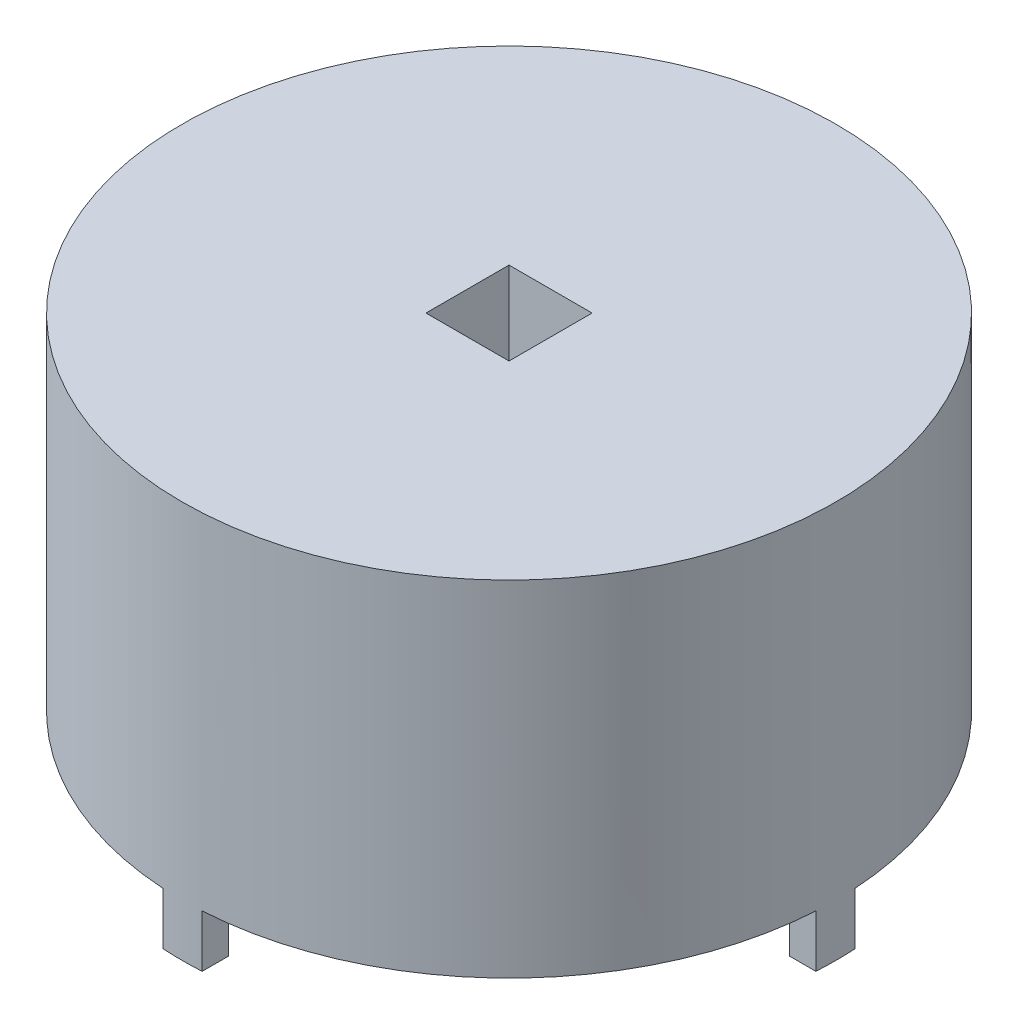
ISO-10303-21;
HEADER;
FILE_DESCRIPTION(('STEP AP214'),'2;1');
FILE_NAME('part.step','',(''),(''),'','','');
FILE_SCHEMA(('AUTOMOTIVE_DESIGN { 1 0 10303 214 1 1 1 1 }'));
ENDSEC;
DATA;
#1=APPLICATION_CONTEXT('core data for automotive mechanical design processes');
#2=APPLICATION_PROTOCOL_DEFINITION('international standard','automotive_design',2000,#1);
#3=PRODUCT_CONTEXT('',#1,'mechanical');
#4=PRODUCT('Part','Part','',(#3));
#5=PRODUCT_RELATED_PRODUCT_CATEGORY('part','',(#4));
#6=PRODUCT_DEFINITION_FORMATION('','',#4);
#7=PRODUCT_DEFINITION_CONTEXT('part definition',#1,'design');
#8=PRODUCT_DEFINITION('design','',#6,#7);
#9=PRODUCT_DEFINITION_SHAPE('','',#8);
#10=(LENGTH_UNIT() NAMED_UNIT(*) SI_UNIT(.MILLI.,.METRE.));
#11=(NAMED_UNIT(*) PLANE_ANGLE_UNIT() SI_UNIT($,.RADIAN.));
#12=(NAMED_UNIT(*) SI_UNIT($,.STERADIAN.) SOLID_ANGLE_UNIT());
#13=UNCERTAINTY_MEASURE_WITH_UNIT(LENGTH_MEASURE(1.E-05),#10,'distance_accuracy_value','');
#14=(GEOMETRIC_REPRESENTATION_CONTEXT(3) GLOBAL_UNCERTAINTY_ASSIGNED_CONTEXT((#13)) GLOBAL_UNIT_ASSIGNED_CONTEXT((#10,
#11,#12)) REPRESENTATION_CONTEXT('',''));
#15=CARTESIAN_POINT('',(0.,0.,0.));
#16=DIRECTION('',(0.,0.,1.));
#17=DIRECTION('',(1.,0.,0.));
#18=AXIS2_PLACEMENT_3D('',#15,#16,#17);
#19=CARTESIAN_POINT('',(0.,-10.,0.));
#20=DIRECTION('',(0.,1.,0.));
#21=DIRECTION('',(0.,0.,1.));
#22=AXIS2_PLACEMENT_3D('',#19,#20,#21);
#23=PLANE('',#22);
#24=DIRECTION('',(0.,0.,-1.));
#25=VECTOR('',#24,1.);
#26=CARTESIAN_POINT('',(-1.5,-10.,0.));
#27=LINE('',#26,#25);
#28=CARTESIAN_POINT('',(-1.5,-10.,-22.951034835057));
#29=VERTEX_POINT('',#28);
#30=CARTESIAN_POINT('',(-1.5,-10.,-24.9549594269356));
#31=VERTEX_POINT('',#30);
#32=EDGE_CURVE('E230',#29,#31,#27,.T.);
#33=ORIENTED_EDGE('',*,*,#32,.F.);
#34=CARTESIAN_POINT('',(0.,-10.,0.));
#35=DIRECTION('',(0.,1.,0.));
#36=DIRECTION('',(0.,0.,1.));
#37=AXIS2_PLACEMENT_3D('',#34,#35,#36);
#38=CIRCLE('',#37,23.);
#39=CARTESIAN_POINT('',(-22.951034835057,-10.,-1.5));
#40=VERTEX_POINT('',#39);
#41=EDGE_CURVE('E334',#29,#40,#38,.T.);
#42=ORIENTED_EDGE('',*,*,#41,.T.);
#43=DIRECTION('',(-1.,0.,0.));
#44=VECTOR('',#43,1.);
#45=CARTESIAN_POINT('',(0.,-10.,-1.5));
#46=LINE('',#45,#44);
#47=CARTESIAN_POINT('',(-24.9549594269356,-10.,-1.5));
#48=VERTEX_POINT('',#47);
#49=EDGE_CURVE('E276',#40,#48,#46,.T.);
#50=ORIENTED_EDGE('',*,*,#49,.T.);
#51=CARTESIAN_POINT('',(0.,-10.,0.));
#52=DIRECTION('',(0.,1.,0.));
#53=DIRECTION('',(0.,0.,1.));
#54=AXIS2_PLACEMENT_3D('',#51,#52,#53);
#55=CIRCLE('',#54,25.);
#56=EDGE_CURVE('E50',#31,#48,#55,.T.);
#57=ORIENTED_EDGE('',*,*,#56,.F.);
#58=EDGE_LOOP('',(#33,#42,#50,#57));
#59=FACE_BOUND('',#58,.T.);
#60=ADVANCED_FACE('F41',(#59),#23,.F.);
#61=CARTESIAN_POINT('',(22.951034835057,-10.,-1.5));
#62=VERTEX_POINT('',#61);
#63=CARTESIAN_POINT('',(1.5,-10.,-22.951034835057));
#64=VERTEX_POINT('',#63);
#65=EDGE_CURVE('E333',#62,#64,#38,.T.);
#66=ORIENTED_EDGE('',*,*,#65,.T.);
#67=DIRECTION('',(0.,0.,-1.));
#68=VECTOR('',#67,1.);
#69=CARTESIAN_POINT('',(1.5,-10.,0.));
#70=LINE('',#69,#68);
#71=CARTESIAN_POINT('',(1.5,-10.,-24.9549594269356));
#72=VERTEX_POINT('',#71);
#73=EDGE_CURVE('E65',#64,#72,#70,.T.);
#74=ORIENTED_EDGE('',*,*,#73,.T.);
#75=CARTESIAN_POINT('',(24.9549594269356,-10.,-1.5));
#76=VERTEX_POINT('',#75);
#77=EDGE_CURVE('E49',#76,#72,#55,.T.);
#78=ORIENTED_EDGE('',*,*,#77,.F.);
#79=DIRECTION('',(1.,0.,0.));
#80=VECTOR('',#79,1.);
#81=CARTESIAN_POINT('',(0.,-10.,-1.5));
#82=LINE('',#81,#80);
#83=EDGE_CURVE('E255',#62,#76,#82,.T.);
#84=ORIENTED_EDGE('',*,*,#83,.F.);
#85=EDGE_LOOP('',(#66,#74,#78,#84));
#86=FACE_BOUND('',#85,.T.);
#87=ADVANCED_FACE('F383',(#86),#23,.F.);
#88=DIRECTION('',(-1.,0.,0.));
#89=VECTOR('',#88,1.);
#90=CARTESIAN_POINT('',(0.,-10.,1.5));
#91=LINE('',#90,#89);
#92=CARTESIAN_POINT('',(-22.951034835057,-10.,1.5));
#93=VERTEX_POINT('',#92);
#94=CARTESIAN_POINT('',(-24.9549594269356,-10.,1.5));
#95=VERTEX_POINT('',#94);
#96=EDGE_CURVE('E281',#93,#95,#91,.T.);
#97=ORIENTED_EDGE('',*,*,#96,.F.);
#98=CARTESIAN_POINT('',(-1.5,-10.,22.951034835057));
#99=VERTEX_POINT('',#98);
#100=EDGE_CURVE('E330',#93,#99,#38,.T.);
#101=ORIENTED_EDGE('',*,*,#100,.T.);
#102=DIRECTION('',(0.,0.,1.));
#103=VECTOR('',#102,1.);
#104=CARTESIAN_POINT('',(-1.5,-10.,0.));
#105=LINE('',#104,#103);
#106=CARTESIAN_POINT('',(-1.5,-10.,24.9549594269356));
#107=VERTEX_POINT('',#106);
#108=EDGE_CURVE('E307',#99,#107,#105,.T.);
#109=ORIENTED_EDGE('',*,*,#108,.T.);
#110=EDGE_CURVE('E51',#95,#107,#55,.T.);
#111=ORIENTED_EDGE('',*,*,#110,.F.);
#112=EDGE_LOOP('',(#97,#101,#109,#111));
#113=FACE_BOUND('',#112,.T.);
#114=ADVANCED_FACE('F339',(#113),#23,.F.);
#115=CARTESIAN_POINT('',(1.5,-10.,22.951034835057));
#116=VERTEX_POINT('',#115);
#117=CARTESIAN_POINT('',(22.951034835057,-10.,1.5));
#118=VERTEX_POINT('',#117);
#119=EDGE_CURVE('E332',#116,#118,#38,.T.);
#120=ORIENTED_EDGE('',*,*,#119,.T.);
#121=DIRECTION('',(1.,0.,0.));
#122=VECTOR('',#121,1.);
#123=CARTESIAN_POINT('',(0.,-10.,1.5));
#124=LINE('',#123,#122);
#125=CARTESIAN_POINT('',(24.9549594269356,-10.,1.5));
#126=VERTEX_POINT('',#125);
#127=EDGE_CURVE('E250',#118,#126,#124,.T.);
#128=ORIENTED_EDGE('',*,*,#127,.T.);
#129=CARTESIAN_POINT('',(1.5,-10.,24.9549594269356));
#130=VERTEX_POINT('',#129);
#131=EDGE_CURVE('E11',#130,#126,#55,.T.);
#132=ORIENTED_EDGE('',*,*,#131,.F.);
#133=DIRECTION('',(0.,0.,1.));
#134=VECTOR('',#133,1.);
#135=CARTESIAN_POINT('',(1.5,-10.,0.));
#136=LINE('',#135,#134);
#137=EDGE_CURVE('E302',#116,#130,#136,.T.);
#138=ORIENTED_EDGE('',*,*,#137,.F.);
#139=EDGE_LOOP('',(#120,#128,#132,#138));
#140=FACE_BOUND('',#139,.T.);
#141=ADVANCED_FACE('F395',(#140),#23,.F.);
#142=CARTESIAN_POINT('',(0.,10.,0.));
#143=DIRECTION('',(0.,-1.,0.));
#144=DIRECTION('',(0.,0.,-1.));
#145=AXIS2_PLACEMENT_3D('',#142,#143,#144);
#146=CYLINDRICAL_SURFACE('',#145,25.);
#147=ORIENTED_EDGE('',*,*,#131,.T.);
#148=DIRECTION('',(0.,1.,0.));
#149=VECTOR('',#148,1.);
#150=CARTESIAN_POINT('',(24.9549594269356,-14.,1.5));
#151=LINE('',#150,#149);
#152=CARTESIAN_POINT('',(24.9549594269356,-14.,1.5));
#153=VERTEX_POINT('',#152);
#154=EDGE_CURVE('E261',#153,#126,#151,.T.);
#155=ORIENTED_EDGE('',*,*,#154,.F.);
#156=CARTESIAN_POINT('',(0.,-14.,0.));
#157=DIRECTION('',(0.,-1.,0.));
#158=DIRECTION('',(0.,0.,-1.));
#159=AXIS2_PLACEMENT_3D('',#156,#157,#158);
#160=CIRCLE('',#159,25.);
#161=CARTESIAN_POINT('',(24.9549594269356,-14.,-1.5));
#162=VERTEX_POINT('',#161);
#163=EDGE_CURVE('E259',#162,#153,#160,.T.);
#164=ORIENTED_EDGE('',*,*,#163,.F.);
#165=DIRECTION('',(0.,1.,0.));
#166=VECTOR('',#165,1.);
#167=CARTESIAN_POINT('',(24.9549594269356,-14.,-1.5));
#168=LINE('',#167,#166);
#169=EDGE_CURVE('E267',#162,#76,#168,.T.);
#170=ORIENTED_EDGE('',*,*,#169,.T.);
#171=ORIENTED_EDGE('',*,*,#77,.T.);
#172=DIRECTION('',(0.,1.,0.));
#173=VECTOR('',#172,1.);
#174=CARTESIAN_POINT('',(1.5,-14.,-24.9549594269356));
#175=LINE('',#174,#173);
#176=CARTESIAN_POINT('',(1.5,-14.,-24.9549594269356));
#177=VERTEX_POINT('',#176);
#178=EDGE_CURVE('E236',#177,#72,#175,.T.);
#179=ORIENTED_EDGE('',*,*,#178,.F.);
#180=CARTESIAN_POINT('',(0.,-14.,0.));
#181=DIRECTION('',(0.,-1.,0.));
#182=DIRECTION('',(0.,0.,-1.));
#183=AXIS2_PLACEMENT_3D('',#180,#181,#182);
#184=CIRCLE('',#183,25.);
#185=CARTESIAN_POINT('',(-1.5,-14.,-24.9549594269356));
#186=VERTEX_POINT('',#185);
#187=EDGE_CURVE('E234',#186,#177,#184,.T.);
#188=ORIENTED_EDGE('',*,*,#187,.F.);
#189=DIRECTION('',(0.,1.,0.));
#190=VECTOR('',#189,1.);
#191=CARTESIAN_POINT('',(-1.5,-14.,-24.9549594269356));
#192=LINE('',#191,#190);
#193=EDGE_CURVE('E241',#186,#31,#192,.T.);
#194=ORIENTED_EDGE('',*,*,#193,.T.);
#195=ORIENTED_EDGE('',*,*,#56,.T.);
#196=DIRECTION('',(0.,1.,0.));
#197=VECTOR('',#196,1.);
#198=CARTESIAN_POINT('',(-24.9549594269356,-14.,-1.5));
#199=LINE('',#198,#197);
#200=CARTESIAN_POINT('',(-24.9549594269356,-14.,-1.5));
#201=VERTEX_POINT('',#200);
#202=EDGE_CURVE('E287',#201,#48,#199,.T.);
#203=ORIENTED_EDGE('',*,*,#202,.F.);
#204=CARTESIAN_POINT('',(0.,-14.,0.));
#205=DIRECTION('',(0.,-1.,0.));
#206=DIRECTION('',(0.,0.,-1.));
#207=AXIS2_PLACEMENT_3D('',#204,#205,#206);
#208=CIRCLE('',#207,25.);
#209=CARTESIAN_POINT('',(-24.9549594269356,-14.,1.5));
#210=VERTEX_POINT('',#209);
#211=EDGE_CURVE('E285',#210,#201,#208,.T.);
#212=ORIENTED_EDGE('',*,*,#211,.F.);
#213=DIRECTION('',(0.,1.,0.));
#214=VECTOR('',#213,1.);
#215=CARTESIAN_POINT('',(-24.9549594269356,-14.,1.5));
#216=LINE('',#215,#214);
#217=EDGE_CURVE('E293',#210,#95,#216,.T.);
#218=ORIENTED_EDGE('',*,*,#217,.T.);
#219=ORIENTED_EDGE('',*,*,#110,.T.);
#220=DIRECTION('',(0.,1.,0.));
#221=VECTOR('',#220,1.);
#222=CARTESIAN_POINT('',(-1.5,-14.,24.9549594269356));
#223=LINE('',#222,#221);
#224=CARTESIAN_POINT('',(-1.5,-14.,24.9549594269356));
#225=VERTEX_POINT('',#224);
#226=EDGE_CURVE('E321',#225,#107,#223,.T.);
#227=ORIENTED_EDGE('',*,*,#226,.F.);
#228=CARTESIAN_POINT('',(0.,-14.,0.));
#229=DIRECTION('',(0.,-1.,0.));
#230=DIRECTION('',(0.,0.,-1.));
#231=AXIS2_PLACEMENT_3D('',#228,#229,#230);
#232=CIRCLE('',#231,25.);
#233=CARTESIAN_POINT('',(1.5,-14.,24.9549594269356));
#234=VERTEX_POINT('',#233);
#235=EDGE_CURVE('E309',#234,#225,#232,.T.);
#236=ORIENTED_EDGE('',*,*,#235,.F.);
#237=DIRECTION('',(0.,1.,0.));
#238=VECTOR('',#237,1.);
#239=CARTESIAN_POINT('',(1.5,-14.,24.9549594269356));
#240=LINE('',#239,#238);
#241=EDGE_CURVE('E324',#234,#130,#240,.T.);
#242=ORIENTED_EDGE('',*,*,#241,.T.);
#243=EDGE_LOOP('',(#147,#155,#164,#170,#171,#179,#188,#194,#195,#203,#212,#218,#219,#227,#236,#242));
#244=FACE_BOUND('',#243,.T.);
#245=CARTESIAN_POINT('',(0.,16.35,0.));
#246=DIRECTION('',(0.,1.,0.));
#247=DIRECTION('',(0.,0.,1.));
#248=AXIS2_PLACEMENT_3D('',#245,#246,#247);
#249=CIRCLE('',#248,25.);
#250=CARTESIAN_POINT('',(0.,16.35,25.));
#251=VERTEX_POINT('',#250);
#252=EDGE_CURVE('E199',#251,#251,#249,.T.);
#253=ORIENTED_EDGE('',*,*,#252,.F.);
#254=EDGE_LOOP('',(#253));
#255=FACE_BOUND('',#254,.T.);
#256=ADVANCED_FACE('F43',(#244,#255),#146,.T.);
#257=CARTESIAN_POINT('',(0.,10.,0.));
#258=DIRECTION('',(0.,-1.,0.));
#259=DIRECTION('',(0.,0.,-1.));
#260=AXIS2_PLACEMENT_3D('',#257,#258,#259);
#261=CYLINDRICAL_SURFACE('',#260,23.);
#262=CARTESIAN_POINT('',(0.,10.,0.));
#263=DIRECTION('',(0.,1.,0.));
#264=DIRECTION('',(0.,0.,1.));
#265=AXIS2_PLACEMENT_3D('',#262,#263,#264);
#266=CIRCLE('',#265,23.);
#267=CARTESIAN_POINT('',(0.,10.,23.));
#268=VERTEX_POINT('',#267);
#269=EDGE_CURVE('E225',#268,#268,#266,.T.);
#270=ORIENTED_EDGE('',*,*,#269,.T.);
#271=EDGE_LOOP('',(#270));
#272=FACE_BOUND('',#271,.T.);
#273=ORIENTED_EDGE('',*,*,#119,.F.);
#274=DIRECTION('',(0.,1.,0.));
#275=VECTOR('',#274,1.);
#276=CARTESIAN_POINT('',(1.49999999999999,-14.,22.951034835057));
#277=LINE('',#276,#275);
#278=CARTESIAN_POINT('',(1.49999999999999,-14.,22.951034835057));
#279=VERTEX_POINT('',#278);
#280=EDGE_CURVE('E327',#279,#116,#277,.T.);
#281=ORIENTED_EDGE('',*,*,#280,.F.);
#282=CARTESIAN_POINT('',(0.,-14.,0.));
#283=DIRECTION('',(0.,-1.,0.));
#284=DIRECTION('',(0.,0.,-1.));
#285=AXIS2_PLACEMENT_3D('',#282,#283,#284);
#286=CIRCLE('',#285,23.);
#287=CARTESIAN_POINT('',(-1.49999999999999,-14.,22.951034835057));
#288=VERTEX_POINT('',#287);
#289=EDGE_CURVE('E303',#288,#279,#286,.F.);
#290=ORIENTED_EDGE('',*,*,#289,.F.);
#291=DIRECTION('',(0.,1.,0.));
#292=VECTOR('',#291,1.);
#293=CARTESIAN_POINT('',(-1.49999999999999,-14.,22.951034835057));
#294=LINE('',#293,#292);
#295=EDGE_CURVE('E314',#288,#99,#294,.T.);
#296=ORIENTED_EDGE('',*,*,#295,.T.);
#297=ORIENTED_EDGE('',*,*,#100,.F.);
#298=DIRECTION('',(0.,1.,0.));
#299=VECTOR('',#298,1.);
#300=CARTESIAN_POINT('',(-22.951034835057,-14.,1.5));
#301=LINE('',#300,#299);
#302=CARTESIAN_POINT('',(-22.951034835057,-14.,1.5));
#303=VERTEX_POINT('',#302);
#304=EDGE_CURVE('E296',#303,#93,#301,.T.);
#305=ORIENTED_EDGE('',*,*,#304,.F.);
#306=CARTESIAN_POINT('',(0.,-14.,0.));
#307=DIRECTION('',(0.,-1.,0.));
#308=DIRECTION('',(0.,0.,-1.));
#309=AXIS2_PLACEMENT_3D('',#306,#307,#308);
#310=CIRCLE('',#309,23.);
#311=CARTESIAN_POINT('',(-22.951034835057,-14.,-1.5));
#312=VERTEX_POINT('',#311);
#313=EDGE_CURVE('E280',#312,#303,#310,.F.);
#314=ORIENTED_EDGE('',*,*,#313,.F.);
#315=DIRECTION('',(0.,1.,0.));
#316=VECTOR('',#315,1.);
#317=CARTESIAN_POINT('',(-22.951034835057,-14.,-1.5));
#318=LINE('',#317,#316);
#319=EDGE_CURVE('E299',#312,#40,#318,.T.);
#320=ORIENTED_EDGE('',*,*,#319,.T.);
#321=ORIENTED_EDGE('',*,*,#41,.F.);
#322=DIRECTION('',(0.,1.,0.));
#323=VECTOR('',#322,1.);
#324=CARTESIAN_POINT('',(-1.5,-14.,-22.951034835057));
#325=LINE('',#324,#323);
#326=CARTESIAN_POINT('',(-1.5,-14.,-22.951034835057));
#327=VERTEX_POINT('',#326);
#328=EDGE_CURVE('E244',#327,#29,#325,.T.);
#329=ORIENTED_EDGE('',*,*,#328,.F.);
#330=CARTESIAN_POINT('',(0.,-14.,0.));
#331=DIRECTION('',(0.,-1.,0.));
#332=DIRECTION('',(0.,0.,-1.));
#333=AXIS2_PLACEMENT_3D('',#330,#331,#332);
#334=CIRCLE('',#333,23.);
#335=CARTESIAN_POINT('',(1.5,-14.,-22.951034835057));
#336=VERTEX_POINT('',#335);
#337=EDGE_CURVE('E229',#336,#327,#334,.F.);
#338=ORIENTED_EDGE('',*,*,#337,.F.);
#339=DIRECTION('',(0.,1.,0.));
#340=VECTOR('',#339,1.);
#341=CARTESIAN_POINT('',(1.5,-14.,-22.951034835057));
#342=LINE('',#341,#340);
#343=EDGE_CURVE('E247',#336,#64,#342,.T.);
#344=ORIENTED_EDGE('',*,*,#343,.T.);
#345=ORIENTED_EDGE('',*,*,#65,.F.);
#346=DIRECTION('',(0.,1.,0.));
#347=VECTOR('',#346,1.);
#348=CARTESIAN_POINT('',(22.951034835057,-14.,-1.5));
#349=LINE('',#348,#347);
#350=CARTESIAN_POINT('',(22.951034835057,-14.,-1.5));
#351=VERTEX_POINT('',#350);
#352=EDGE_CURVE('E270',#351,#62,#349,.T.);
#353=ORIENTED_EDGE('',*,*,#352,.F.);
#354=CARTESIAN_POINT('',(0.,-14.,0.));
#355=DIRECTION('',(0.,-1.,0.));
#356=DIRECTION('',(0.,0.,-1.));
#357=AXIS2_PLACEMENT_3D('',#354,#355,#356);
#358=CIRCLE('',#357,23.);
#359=CARTESIAN_POINT('',(22.951034835057,-14.,1.5));
#360=VERTEX_POINT('',#359);
#361=EDGE_CURVE('E254',#360,#351,#358,.F.);
#362=ORIENTED_EDGE('',*,*,#361,.F.);
#363=DIRECTION('',(0.,1.,0.));
#364=VECTOR('',#363,1.);
#365=CARTESIAN_POINT('',(22.951034835057,-14.,1.5));
#366=LINE('',#365,#364);
#367=EDGE_CURVE('E273',#360,#118,#366,.T.);
#368=ORIENTED_EDGE('',*,*,#367,.T.);
#369=EDGE_LOOP('',(#273,#281,#290,#296,#297,#305,#314,#320,#321,#329,#338,#344,#345,#353,#362,#368));
#370=FACE_BOUND('',#369,.T.);
#371=ADVANCED_FACE('F344',(#272,#370),#261,.F.);
#372=CARTESIAN_POINT('',(1.5,-14.,0.));
#373=DIRECTION('',(-1.,0.,0.));
#374=DIRECTION('',(0.,0.,1.));
#375=AXIS2_PLACEMENT_3D('',#372,#373,#374);
#376=PLANE('',#375);
#377=ORIENTED_EDGE('',*,*,#137,.T.);
#378=ORIENTED_EDGE('',*,*,#241,.F.);
#379=DIRECTION('',(0.,0.,1.));
#380=VECTOR('',#379,1.);
#381=CARTESIAN_POINT('',(1.5,-14.,0.));
#382=LINE('',#381,#380);
#383=EDGE_CURVE('E306',#279,#234,#382,.T.);
#384=ORIENTED_EDGE('',*,*,#383,.F.);
#385=ORIENTED_EDGE('',*,*,#280,.T.);
#386=EDGE_LOOP('',(#377,#378,#384,#385));
#387=FACE_BOUND('',#386,.T.);
#388=ADVANCED_FACE('F398',(#387),#376,.F.);
#389=CARTESIAN_POINT('',(-1.5,-14.,0.));
#390=DIRECTION('',(-1.,0.,0.));
#391=DIRECTION('',(0.,0.,1.));
#392=AXIS2_PLACEMENT_3D('',#389,#390,#391);
#393=PLANE('',#392);
#394=ORIENTED_EDGE('',*,*,#108,.F.);
#395=ORIENTED_EDGE('',*,*,#295,.F.);
#396=DIRECTION('',(0.,0.,1.));
#397=VECTOR('',#396,1.);
#398=CARTESIAN_POINT('',(-1.5,-14.,0.));
#399=LINE('',#398,#397);
#400=EDGE_CURVE('E311',#288,#225,#399,.T.);
#401=ORIENTED_EDGE('',*,*,#400,.T.);
#402=ORIENTED_EDGE('',*,*,#226,.T.);
#403=EDGE_LOOP('',(#394,#395,#401,#402));
#404=FACE_BOUND('',#403,.T.);
#405=ADVANCED_FACE('F348',(#404),#393,.T.);
#406=CARTESIAN_POINT('',(0.,-14.,0.));
#407=DIRECTION('',(0.,-1.,0.));
#408=DIRECTION('',(0.,0.,-1.));
#409=AXIS2_PLACEMENT_3D('',#406,#407,#408);
#410=PLANE('',#409);
#411=ORIENTED_EDGE('',*,*,#289,.T.);
#412=ORIENTED_EDGE('',*,*,#383,.T.);
#413=ORIENTED_EDGE('',*,*,#235,.T.);
#414=ORIENTED_EDGE('',*,*,#400,.F.);
#415=EDGE_LOOP('',(#411,#412,#413,#414));
#416=FACE_BOUND('',#415,.T.);
#417=ADVANCED_FACE('F400',(#416),#410,.T.);
#418=CARTESIAN_POINT('',(0.,-14.,-1.5));
#419=DIRECTION('',(0.,0.,-1.));
#420=DIRECTION('',(-1.,0.,0.));
#421=AXIS2_PLACEMENT_3D('',#418,#419,#420);
#422=PLANE('',#421);
#423=ORIENTED_EDGE('',*,*,#49,.F.);
#424=ORIENTED_EDGE('',*,*,#319,.F.);
#425=DIRECTION('',(-1.,0.,0.));
#426=VECTOR('',#425,1.);
#427=CARTESIAN_POINT('',(0.,-14.,-1.5));
#428=LINE('',#427,#426);
#429=EDGE_CURVE('E277',#312,#201,#428,.T.);
#430=ORIENTED_EDGE('',*,*,#429,.T.);
#431=ORIENTED_EDGE('',*,*,#202,.T.);
#432=EDGE_LOOP('',(#423,#424,#430,#431));
#433=FACE_BOUND('',#432,.T.);
#434=ADVANCED_FACE('F365',(#433),#422,.T.);
#435=CARTESIAN_POINT('',(0.,-14.,1.5));
#436=DIRECTION('',(0.,0.,-1.));
#437=DIRECTION('',(-1.,0.,0.));
#438=AXIS2_PLACEMENT_3D('',#435,#436,#437);
#439=PLANE('',#438);
#440=ORIENTED_EDGE('',*,*,#96,.T.);
#441=ORIENTED_EDGE('',*,*,#217,.F.);
#442=DIRECTION('',(-1.,0.,0.));
#443=VECTOR('',#442,1.);
#444=CARTESIAN_POINT('',(0.,-14.,1.5));
#445=LINE('',#444,#443);
#446=EDGE_CURVE('E283',#303,#210,#445,.T.);
#447=ORIENTED_EDGE('',*,*,#446,.F.);
#448=ORIENTED_EDGE('',*,*,#304,.T.);
#449=EDGE_LOOP('',(#440,#441,#447,#448));
#450=FACE_BOUND('',#449,.T.);
#451=ADVANCED_FACE('F356',(#450),#439,.F.);
#452=CARTESIAN_POINT('',(0.,-14.,0.));
#453=DIRECTION('',(0.,-1.,0.));
#454=DIRECTION('',(0.,0.,-1.));
#455=AXIS2_PLACEMENT_3D('',#452,#453,#454);
#456=PLANE('',#455);
#457=ORIENTED_EDGE('',*,*,#429,.F.);
#458=ORIENTED_EDGE('',*,*,#313,.T.);
#459=ORIENTED_EDGE('',*,*,#446,.T.);
#460=ORIENTED_EDGE('',*,*,#211,.T.);
#461=EDGE_LOOP('',(#457,#458,#459,#460));
#462=FACE_BOUND('',#461,.T.);
#463=ADVANCED_FACE('F362',(#462),#456,.T.);
#464=CARTESIAN_POINT('',(0.,-14.,1.5));
#465=DIRECTION('',(0.,0.,1.));
#466=DIRECTION('',(1.,0.,0.));
#467=AXIS2_PLACEMENT_3D('',#464,#465,#466);
#468=PLANE('',#467);
#469=ORIENTED_EDGE('',*,*,#127,.F.);
#470=ORIENTED_EDGE('',*,*,#367,.F.);
#471=DIRECTION('',(1.,0.,0.));
#472=VECTOR('',#471,1.);
#473=CARTESIAN_POINT('',(0.,-14.,1.5));
#474=LINE('',#473,#472);
#475=EDGE_CURVE('E251',#360,#153,#474,.T.);
#476=ORIENTED_EDGE('',*,*,#475,.T.);
#477=ORIENTED_EDGE('',*,*,#154,.T.);
#478=EDGE_LOOP('',(#469,#470,#476,#477));
#479=FACE_BOUND('',#478,.T.);
#480=ADVANCED_FACE('F394',(#479),#468,.T.);
#481=CARTESIAN_POINT('',(0.,-14.,-1.5));
#482=DIRECTION('',(0.,0.,1.));
#483=DIRECTION('',(1.,0.,0.));
#484=AXIS2_PLACEMENT_3D('',#481,#482,#483);
#485=PLANE('',#484);
#486=ORIENTED_EDGE('',*,*,#83,.T.);
#487=ORIENTED_EDGE('',*,*,#169,.F.);
#488=DIRECTION('',(1.,0.,0.));
#489=VECTOR('',#488,1.);
#490=CARTESIAN_POINT('',(0.,-14.,-1.5));
#491=LINE('',#490,#489);
#492=EDGE_CURVE('E257',#351,#162,#491,.T.);
#493=ORIENTED_EDGE('',*,*,#492,.F.);
#494=ORIENTED_EDGE('',*,*,#352,.T.);
#495=EDGE_LOOP('',(#486,#487,#493,#494));
#496=FACE_BOUND('',#495,.T.);
#497=ADVANCED_FACE('F386',(#496),#485,.F.);
#498=CARTESIAN_POINT('',(0.,-14.,0.));
#499=DIRECTION('',(0.,-1.,0.));
#500=DIRECTION('',(0.,0.,-1.));
#501=AXIS2_PLACEMENT_3D('',#498,#499,#500);
#502=PLANE('',#501);
#503=ORIENTED_EDGE('',*,*,#475,.F.);
#504=ORIENTED_EDGE('',*,*,#361,.T.);
#505=ORIENTED_EDGE('',*,*,#492,.T.);
#506=ORIENTED_EDGE('',*,*,#163,.T.);
#507=EDGE_LOOP('',(#503,#504,#505,#506));
#508=FACE_BOUND('',#507,.T.);
#509=ADVANCED_FACE('F390',(#508),#502,.T.);
#510=CARTESIAN_POINT('',(1.5,-14.,0.));
#511=DIRECTION('',(1.,0.,0.));
#512=DIRECTION('',(0.,0.,-1.));
#513=AXIS2_PLACEMENT_3D('',#510,#511,#512);
#514=PLANE('',#513);
#515=ORIENTED_EDGE('',*,*,#73,.F.);
#516=ORIENTED_EDGE('',*,*,#343,.F.);
#517=DIRECTION('',(0.,0.,-1.));
#518=VECTOR('',#517,1.);
#519=CARTESIAN_POINT('',(1.5,-14.,0.));
#520=LINE('',#519,#518);
#521=EDGE_CURVE('E226',#336,#177,#520,.T.);
#522=ORIENTED_EDGE('',*,*,#521,.T.);
#523=ORIENTED_EDGE('',*,*,#178,.T.);
#524=EDGE_LOOP('',(#515,#516,#522,#523));
#525=FACE_BOUND('',#524,.T.);
#526=ADVANCED_FACE('F378',(#525),#514,.T.);
#527=CARTESIAN_POINT('',(-1.5,-14.,0.));
#528=DIRECTION('',(1.,0.,0.));
#529=DIRECTION('',(0.,0.,-1.));
#530=AXIS2_PLACEMENT_3D('',#527,#528,#529);
#531=PLANE('',#530);
#532=ORIENTED_EDGE('',*,*,#32,.T.);
#533=ORIENTED_EDGE('',*,*,#193,.F.);
#534=DIRECTION('',(0.,0.,-1.));
#535=VECTOR('',#534,1.);
#536=CARTESIAN_POINT('',(-1.5,-14.,0.));
#537=LINE('',#536,#535);
#538=EDGE_CURVE('E232',#327,#186,#537,.T.);
#539=ORIENTED_EDGE('',*,*,#538,.F.);
#540=ORIENTED_EDGE('',*,*,#328,.T.);
#541=EDGE_LOOP('',(#532,#533,#539,#540));
#542=FACE_BOUND('',#541,.T.);
#543=ADVANCED_FACE('F372',(#542),#531,.F.);
#544=CARTESIAN_POINT('',(0.,-14.,0.));
#545=DIRECTION('',(0.,-1.,0.));
#546=DIRECTION('',(0.,0.,-1.));
#547=AXIS2_PLACEMENT_3D('',#544,#545,#546);
#548=PLANE('',#547);
#549=ORIENTED_EDGE('',*,*,#521,.F.);
#550=ORIENTED_EDGE('',*,*,#337,.T.);
#551=ORIENTED_EDGE('',*,*,#538,.T.);
#552=ORIENTED_EDGE('',*,*,#187,.T.);
#553=EDGE_LOOP('',(#549,#550,#551,#552));
#554=FACE_BOUND('',#553,.T.);
#555=ADVANCED_FACE('F375',(#554),#548,.T.);
#556=CARTESIAN_POINT('',(0.,10.,0.));
#557=DIRECTION('',(0.,1.,0.));
#558=DIRECTION('',(0.,0.,1.));
#559=AXIS2_PLACEMENT_3D('',#556,#557,#558);
#560=PLANE('',#559);
#561=DIRECTION('',(0.,0.,-1.));
#562=VECTOR('',#561,1.);
#563=CARTESIAN_POINT('',(3.175,10.,3.175));
#564=LINE('',#563,#562);
#565=CARTESIAN_POINT('',(3.175,10.,3.175));
#566=VERTEX_POINT('',#565);
#567=CARTESIAN_POINT('',(3.175,10.,-3.175));
#568=VERTEX_POINT('',#567);
#569=EDGE_CURVE('E211',#566,#568,#564,.T.);
#570=ORIENTED_EDGE('',*,*,#569,.T.);
#571=DIRECTION('',(-1.,0.,0.));
#572=VECTOR('',#571,1.);
#573=CARTESIAN_POINT('',(-3.175,10.,-3.175));
#574=LINE('',#573,#572);
#575=CARTESIAN_POINT('',(-3.175,10.,-3.175));
#576=VERTEX_POINT('',#575);
#577=EDGE_CURVE('E198',#568,#576,#574,.T.);
#578=ORIENTED_EDGE('',*,*,#577,.T.);
#579=DIRECTION('',(0.,0.,1.));
#580=VECTOR('',#579,1.);
#581=CARTESIAN_POINT('',(-3.175,10.,3.175));
#582=LINE('',#581,#580);
#583=CARTESIAN_POINT('',(-3.175,10.,3.175));
#584=VERTEX_POINT('',#583);
#585=EDGE_CURVE('E214',#576,#584,#582,.T.);
#586=ORIENTED_EDGE('',*,*,#585,.T.);
#587=DIRECTION('',(1.,0.,0.));
#588=VECTOR('',#587,1.);
#589=CARTESIAN_POINT('',(-3.175,10.,3.175));
#590=LINE('',#589,#588);
#591=EDGE_CURVE('E192',#584,#566,#590,.T.);
#592=ORIENTED_EDGE('',*,*,#591,.T.);
#593=EDGE_LOOP('',(#570,#578,#586,#592));
#594=FACE_BOUND('',#593,.T.);
#595=ORIENTED_EDGE('',*,*,#269,.F.);
#596=EDGE_LOOP('',(#595));
#597=FACE_BOUND('',#596,.T.);
#598=ADVANCED_FACE('F512',(#594,#597),#560,.F.);
#599=CARTESIAN_POINT('',(0.,16.35,0.));
#600=DIRECTION('',(0.,1.,0.));
#601=DIRECTION('',(0.,0.,1.));
#602=AXIS2_PLACEMENT_3D('',#599,#600,#601);
#603=PLANE('',#602);
#604=ORIENTED_EDGE('',*,*,#252,.T.);
#605=EDGE_LOOP('',(#604));
#606=FACE_BOUND('',#605,.T.);
#607=DIRECTION('',(-1.,0.,0.));
#608=VECTOR('',#607,1.);
#609=CARTESIAN_POINT('',(-3.175,16.35,-3.175));
#610=LINE('',#609,#608);
#611=CARTESIAN_POINT('',(3.175,16.35,-3.175));
#612=VERTEX_POINT('',#611);
#613=CARTESIAN_POINT('',(-3.175,16.35,-3.175));
#614=VERTEX_POINT('',#613);
#615=EDGE_CURVE('E191',#612,#614,#610,.T.);
#616=ORIENTED_EDGE('',*,*,#615,.F.);
#617=DIRECTION('',(0.,0.,-1.));
#618=VECTOR('',#617,1.);
#619=CARTESIAN_POINT('',(3.175,16.35,3.175));
#620=LINE('',#619,#618);
#621=CARTESIAN_POINT('',(3.175,16.35,3.175));
#622=VERTEX_POINT('',#621);
#623=EDGE_CURVE('E181',#622,#612,#620,.T.);
#624=ORIENTED_EDGE('',*,*,#623,.F.);
#625=DIRECTION('',(1.,0.,0.));
#626=VECTOR('',#625,1.);
#627=CARTESIAN_POINT('',(-3.175,16.35,3.175));
#628=LINE('',#627,#626);
#629=CARTESIAN_POINT('',(-3.175,16.35,3.175));
#630=VERTEX_POINT('',#629);
#631=EDGE_CURVE('E207',#630,#622,#628,.T.);
#632=ORIENTED_EDGE('',*,*,#631,.F.);
#633=DIRECTION('',(0.,0.,1.));
#634=VECTOR('',#633,1.);
#635=CARTESIAN_POINT('',(-3.175,16.35,3.175));
#636=LINE('',#635,#634);
#637=EDGE_CURVE('E205',#614,#630,#636,.T.);
#638=ORIENTED_EDGE('',*,*,#637,.F.);
#639=EDGE_LOOP('',(#616,#624,#632,#638));
#640=FACE_BOUND('',#639,.T.);
#641=ADVANCED_FACE('F203',(#606,#640),#603,.T.);
#642=CARTESIAN_POINT('',(3.175,16.35,3.175));
#643=DIRECTION('',(-1.,0.,0.));
#644=DIRECTION('',(0.,0.,1.));
#645=AXIS2_PLACEMENT_3D('',#642,#643,#644);
#646=PLANE('',#645);
#647=ORIENTED_EDGE('',*,*,#569,.F.);
#648=DIRECTION('',(0.,-1.,0.));
#649=VECTOR('',#648,1.);
#650=CARTESIAN_POINT('',(3.175,16.35,3.175));
#651=LINE('',#650,#649);
#652=EDGE_CURVE('E187',#622,#566,#651,.T.);
#653=ORIENTED_EDGE('',*,*,#652,.F.);
#654=ORIENTED_EDGE('',*,*,#623,.T.);
#655=DIRECTION('',(0.,-1.,0.));
#656=VECTOR('',#655,1.);
#657=CARTESIAN_POINT('',(3.175,16.35,-3.175));
#658=LINE('',#657,#656);
#659=EDGE_CURVE('E184',#612,#568,#658,.T.);
#660=ORIENTED_EDGE('',*,*,#659,.T.);
#661=EDGE_LOOP('',(#647,#653,#654,#660));
#662=FACE_BOUND('',#661,.T.);
#663=ADVANCED_FACE('F183',(#662),#646,.T.);
#664=CARTESIAN_POINT('',(-3.175,16.35,-3.175));
#665=DIRECTION('',(0.,0.,1.));
#666=DIRECTION('',(1.,0.,0.));
#667=AXIS2_PLACEMENT_3D('',#664,#665,#666);
#668=PLANE('',#667);
#669=ORIENTED_EDGE('',*,*,#577,.F.);
#670=ORIENTED_EDGE('',*,*,#659,.F.);
#671=ORIENTED_EDGE('',*,*,#615,.T.);
#672=DIRECTION('',(0.,-1.,0.));
#673=VECTOR('',#672,1.);
#674=CARTESIAN_POINT('',(-3.175,16.35,-3.175));
#675=LINE('',#674,#673);
#676=EDGE_CURVE('E200',#614,#576,#675,.T.);
#677=ORIENTED_EDGE('',*,*,#676,.T.);
#678=EDGE_LOOP('',(#669,#670,#671,#677));
#679=FACE_BOUND('',#678,.T.);
#680=ADVANCED_FACE('F195',(#679),#668,.T.);
#681=CARTESIAN_POINT('',(-3.175,16.35,3.175));
#682=DIRECTION('',(1.,0.,0.));
#683=DIRECTION('',(0.,0.,-1.));
#684=AXIS2_PLACEMENT_3D('',#681,#682,#683);
#685=PLANE('',#684);
#686=ORIENTED_EDGE('',*,*,#585,.F.);
#687=ORIENTED_EDGE('',*,*,#676,.F.);
#688=ORIENTED_EDGE('',*,*,#637,.T.);
#689=DIRECTION('',(0.,-1.,0.));
#690=VECTOR('',#689,1.);
#691=CARTESIAN_POINT('',(-3.175,16.35,3.175));
#692=LINE('',#691,#690);
#693=EDGE_CURVE('E220',#630,#584,#692,.T.);
#694=ORIENTED_EDGE('',*,*,#693,.T.);
#695=EDGE_LOOP('',(#686,#687,#688,#694));
#696=FACE_BOUND('',#695,.T.);
#697=ADVANCED_FACE('F544',(#696),#685,.T.);
#698=CARTESIAN_POINT('',(-3.175,16.35,3.175));
#699=DIRECTION('',(0.,0.,-1.));
#700=DIRECTION('',(-1.,0.,0.));
#701=AXIS2_PLACEMENT_3D('',#698,#699,#700);
#702=PLANE('',#701);
#703=ORIENTED_EDGE('',*,*,#591,.F.);
#704=ORIENTED_EDGE('',*,*,#693,.F.);
#705=ORIENTED_EDGE('',*,*,#631,.T.);
#706=ORIENTED_EDGE('',*,*,#652,.T.);
#707=EDGE_LOOP('',(#703,#704,#705,#706));
#708=FACE_BOUND('',#707,.T.);
#709=ADVANCED_FACE('F552',(#708),#702,.T.);
#710=CLOSED_SHELL('',(#60,#87,#114,#141,#256,#371,#388,#405,#417,#434,#451,#463,#480,#497,#509,
#526,#543,#555,#598,#641,#663,#680,#697,#709));
#711=MANIFOLD_SOLID_BREP('B2',#710);
#712=ADVANCED_BREP_SHAPE_REPRESENTATION('',(#18,#711),#14);
#713=SHAPE_DEFINITION_REPRESENTATION(#9,#712);
ENDSEC;
END-ISO-10303-21;
